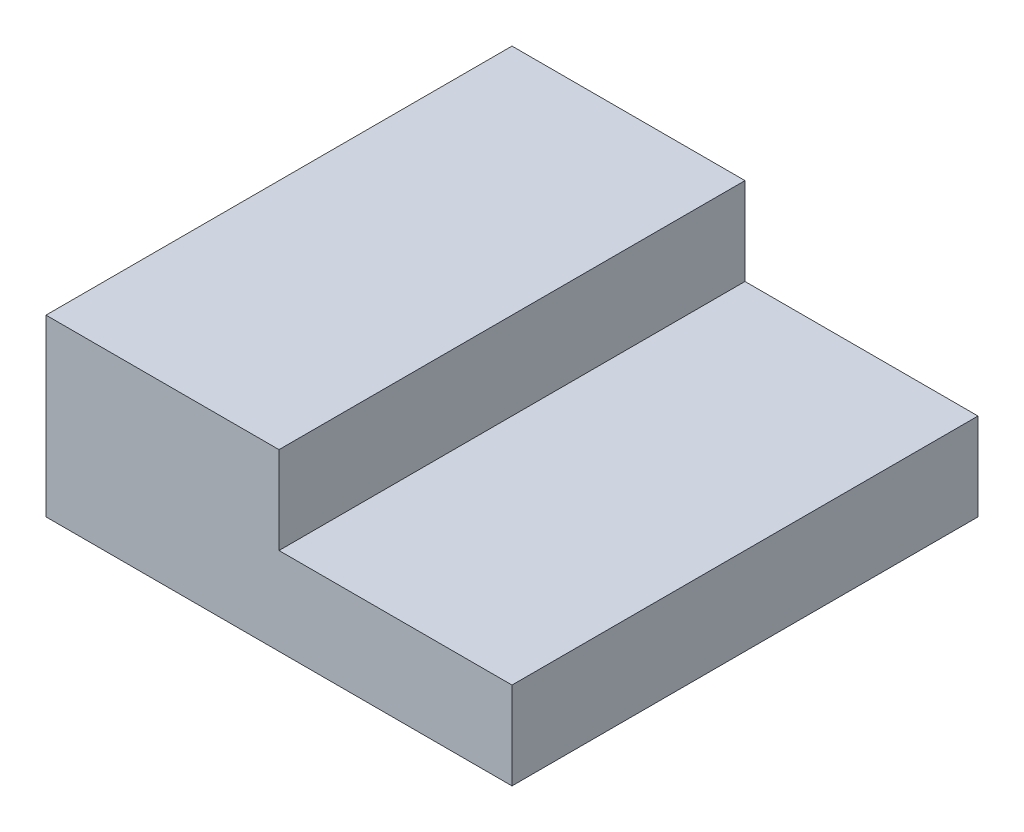
ISO-10303-21;
HEADER;
FILE_DESCRIPTION(('STEP AP214'),'2;1');
FILE_NAME('part.step','',(''),(''),'','','');
FILE_SCHEMA(('AUTOMOTIVE_DESIGN { 1 0 10303 214 1 1 1 1 }'));
ENDSEC;
DATA;
#1=APPLICATION_CONTEXT('core data for automotive mechanical design processes');
#2=APPLICATION_PROTOCOL_DEFINITION('international standard','automotive_design',2000,#1);
#3=PRODUCT_CONTEXT('',#1,'mechanical');
#4=PRODUCT('Part','Part','',(#3));
#5=PRODUCT_RELATED_PRODUCT_CATEGORY('part','',(#4));
#6=PRODUCT_DEFINITION_FORMATION('','',#4);
#7=PRODUCT_DEFINITION_CONTEXT('part definition',#1,'design');
#8=PRODUCT_DEFINITION('design','',#6,#7);
#9=PRODUCT_DEFINITION_SHAPE('','',#8);
#10=(LENGTH_UNIT() NAMED_UNIT(*) SI_UNIT(.MILLI.,.METRE.));
#11=(NAMED_UNIT(*) PLANE_ANGLE_UNIT() SI_UNIT($,.RADIAN.));
#12=(NAMED_UNIT(*) SI_UNIT($,.STERADIAN.) SOLID_ANGLE_UNIT());
#13=UNCERTAINTY_MEASURE_WITH_UNIT(LENGTH_MEASURE(1.E-05),#10,'distance_accuracy_value','');
#14=(GEOMETRIC_REPRESENTATION_CONTEXT(3) GLOBAL_UNCERTAINTY_ASSIGNED_CONTEXT((#13)) GLOBAL_UNIT_ASSIGNED_CONTEXT((#10,
#11,#12)) REPRESENTATION_CONTEXT('',''));
#15=CARTESIAN_POINT('',(0.,0.,0.));
#16=DIRECTION('',(0.,0.,1.));
#17=DIRECTION('',(1.,0.,0.));
#18=AXIS2_PLACEMENT_3D('',#15,#16,#17);
#19=CARTESIAN_POINT('',(0.,228.6,-609.6));
#20=DIRECTION('',(-1.,0.,0.));
#21=DIRECTION('',(0.,-1.,0.));
#22=AXIS2_PLACEMENT_3D('',#19,#20,#21);
#23=PLANE('',#22);
#24=DIRECTION('',(0.,-1.,0.));
#25=VECTOR('',#24,1.);
#26=CARTESIAN_POINT('',(0.,228.6,0.));
#27=LINE('',#26,#25);
#28=CARTESIAN_POINT('',(0.,228.6,0.));
#29=VERTEX_POINT('',#28);
#30=CARTESIAN_POINT('',(0.,0.,0.));
#31=VERTEX_POINT('',#30);
#32=EDGE_CURVE('E120',#29,#31,#27,.T.);
#33=ORIENTED_EDGE('',*,*,#32,.F.);
#34=DIRECTION('',(0.,0.,1.));
#35=VECTOR('',#34,1.);
#36=CARTESIAN_POINT('',(0.,228.6,-609.6));
#37=LINE('',#36,#35);
#38=CARTESIAN_POINT('',(0.,228.6,-609.6));
#39=VERTEX_POINT('',#38);
#40=EDGE_CURVE('E11',#39,#29,#37,.T.);
#41=ORIENTED_EDGE('',*,*,#40,.F.);
#42=DIRECTION('',(0.,-1.,0.));
#43=VECTOR('',#42,1.);
#44=CARTESIAN_POINT('',(0.,228.6,-609.6));
#45=LINE('',#44,#43);
#46=CARTESIAN_POINT('',(0.,0.,-609.6));
#47=VERTEX_POINT('',#46);
#48=EDGE_CURVE('E134',#39,#47,#45,.T.);
#49=ORIENTED_EDGE('',*,*,#48,.T.);
#50=DIRECTION('',(0.,0.,1.));
#51=VECTOR('',#50,1.);
#52=CARTESIAN_POINT('',(0.,0.,-609.6));
#53=LINE('',#52,#51);
#54=EDGE_CURVE('E38',#47,#31,#53,.T.);
#55=ORIENTED_EDGE('',*,*,#54,.T.);
#56=EDGE_LOOP('',(#33,#41,#49,#55));
#57=FACE_BOUND('',#56,.T.);
#58=ADVANCED_FACE('F35',(#57),#23,.T.);
#59=CARTESIAN_POINT('',(304.8,228.6,-609.6));
#60=DIRECTION('',(0.,1.,0.));
#61=DIRECTION('',(-1.,0.,0.));
#62=AXIS2_PLACEMENT_3D('',#59,#60,#61);
#63=PLANE('',#62);
#64=DIRECTION('',(-1.,0.,0.));
#65=VECTOR('',#64,1.);
#66=CARTESIAN_POINT('',(304.8,228.6,0.));
#67=LINE('',#66,#65);
#68=CARTESIAN_POINT('',(304.8,228.6,0.));
#69=VERTEX_POINT('',#68);
#70=EDGE_CURVE('E132',#69,#29,#67,.T.);
#71=ORIENTED_EDGE('',*,*,#70,.F.);
#72=DIRECTION('',(0.,0.,1.));
#73=VECTOR('',#72,1.);
#74=CARTESIAN_POINT('',(304.8,228.6,-609.6));
#75=LINE('',#74,#73);
#76=CARTESIAN_POINT('',(304.8,228.6,-609.6));
#77=VERTEX_POINT('',#76);
#78=EDGE_CURVE('E44',#77,#69,#75,.T.);
#79=ORIENTED_EDGE('',*,*,#78,.F.);
#80=DIRECTION('',(-1.,0.,0.));
#81=VECTOR('',#80,1.);
#82=CARTESIAN_POINT('',(304.8,228.6,-609.6));
#83=LINE('',#82,#81);
#84=EDGE_CURVE('E110',#77,#39,#83,.T.);
#85=ORIENTED_EDGE('',*,*,#84,.T.);
#86=ORIENTED_EDGE('',*,*,#40,.T.);
#87=EDGE_LOOP('',(#71,#79,#85,#86));
#88=FACE_BOUND('',#87,.T.);
#89=ADVANCED_FACE('F142',(#88),#63,.T.);
#90=CARTESIAN_POINT('',(304.8,114.3,-609.6));
#91=DIRECTION('',(1.,0.,0.));
#92=DIRECTION('',(0.,0.,-1.));
#93=AXIS2_PLACEMENT_3D('',#90,#91,#92);
#94=PLANE('',#93);
#95=DIRECTION('',(0.,1.,0.));
#96=VECTOR('',#95,1.);
#97=CARTESIAN_POINT('',(304.8,114.3,0.));
#98=LINE('',#97,#96);
#99=CARTESIAN_POINT('',(304.8,114.3,0.));
#100=VERTEX_POINT('',#99);
#101=EDGE_CURVE('E97',#100,#69,#98,.T.);
#102=ORIENTED_EDGE('',*,*,#101,.F.);
#103=DIRECTION('',(0.,0.,1.));
#104=VECTOR('',#103,1.);
#105=CARTESIAN_POINT('',(304.8,114.3,-609.6));
#106=LINE('',#105,#104);
#107=CARTESIAN_POINT('',(304.8,114.3,-609.6));
#108=VERTEX_POINT('',#107);
#109=EDGE_CURVE('E92',#108,#100,#106,.T.);
#110=ORIENTED_EDGE('',*,*,#109,.F.);
#111=DIRECTION('',(0.,1.,0.));
#112=VECTOR('',#111,1.);
#113=CARTESIAN_POINT('',(304.8,114.3,-609.6));
#114=LINE('',#113,#112);
#115=EDGE_CURVE('E95',#108,#77,#114,.T.);
#116=ORIENTED_EDGE('',*,*,#115,.T.);
#117=ORIENTED_EDGE('',*,*,#78,.T.);
#118=EDGE_LOOP('',(#102,#110,#116,#117));
#119=FACE_BOUND('',#118,.T.);
#120=ADVANCED_FACE('F94',(#119),#94,.T.);
#121=CARTESIAN_POINT('',(609.6,114.3,-609.6));
#122=DIRECTION('',(0.,1.,0.));
#123=DIRECTION('',(-1.,0.,0.));
#124=AXIS2_PLACEMENT_3D('',#121,#122,#123);
#125=PLANE('',#124);
#126=DIRECTION('',(-1.,0.,0.));
#127=VECTOR('',#126,1.);
#128=CARTESIAN_POINT('',(609.6,114.3,0.));
#129=LINE('',#128,#127);
#130=CARTESIAN_POINT('',(609.6,114.3,0.));
#131=VERTEX_POINT('',#130);
#132=EDGE_CURVE('E129',#131,#100,#129,.T.);
#133=ORIENTED_EDGE('',*,*,#132,.F.);
#134=DIRECTION('',(0.,0.,1.));
#135=VECTOR('',#134,1.);
#136=CARTESIAN_POINT('',(609.6,114.3,-609.6));
#137=LINE('',#136,#135);
#138=CARTESIAN_POINT('',(609.6,114.3,-609.6));
#139=VERTEX_POINT('',#138);
#140=EDGE_CURVE('E102',#139,#131,#137,.T.);
#141=ORIENTED_EDGE('',*,*,#140,.F.);
#142=DIRECTION('',(-1.,0.,0.));
#143=VECTOR('',#142,1.);
#144=CARTESIAN_POINT('',(609.6,114.3,-609.6));
#145=LINE('',#144,#143);
#146=EDGE_CURVE('E108',#139,#108,#145,.T.);
#147=ORIENTED_EDGE('',*,*,#146,.T.);
#148=ORIENTED_EDGE('',*,*,#109,.T.);
#149=EDGE_LOOP('',(#133,#141,#147,#148));
#150=FACE_BOUND('',#149,.T.);
#151=ADVANCED_FACE('F112',(#150),#125,.T.);
#152=CARTESIAN_POINT('',(609.6,0.,-609.6));
#153=DIRECTION('',(1.,0.,0.));
#154=DIRECTION('',(0.,0.,-1.));
#155=AXIS2_PLACEMENT_3D('',#152,#153,#154);
#156=PLANE('',#155);
#157=DIRECTION('',(0.,1.,0.));
#158=VECTOR('',#157,1.);
#159=CARTESIAN_POINT('',(609.6,0.,0.));
#160=LINE('',#159,#158);
#161=CARTESIAN_POINT('',(609.6,0.,0.));
#162=VERTEX_POINT('',#161);
#163=EDGE_CURVE('E126',#162,#131,#160,.T.);
#164=ORIENTED_EDGE('',*,*,#163,.F.);
#165=DIRECTION('',(0.,0.,1.));
#166=VECTOR('',#165,1.);
#167=CARTESIAN_POINT('',(609.6,0.,-609.6));
#168=LINE('',#167,#166);
#169=CARTESIAN_POINT('',(609.6,0.,-609.6));
#170=VERTEX_POINT('',#169);
#171=EDGE_CURVE('E137',#170,#162,#168,.T.);
#172=ORIENTED_EDGE('',*,*,#171,.F.);
#173=DIRECTION('',(0.,1.,0.));
#174=VECTOR('',#173,1.);
#175=CARTESIAN_POINT('',(609.6,0.,-609.6));
#176=LINE('',#175,#174);
#177=EDGE_CURVE('E113',#170,#139,#176,.T.);
#178=ORIENTED_EDGE('',*,*,#177,.T.);
#179=ORIENTED_EDGE('',*,*,#140,.T.);
#180=EDGE_LOOP('',(#164,#172,#178,#179));
#181=FACE_BOUND('',#180,.T.);
#182=ADVANCED_FACE('F155',(#181),#156,.T.);
#183=CARTESIAN_POINT('',(0.,0.,-609.6));
#184=DIRECTION('',(0.,-1.,0.));
#185=DIRECTION('',(0.,0.,-1.));
#186=AXIS2_PLACEMENT_3D('',#183,#184,#185);
#187=PLANE('',#186);
#188=DIRECTION('',(1.,0.,0.));
#189=VECTOR('',#188,1.);
#190=CARTESIAN_POINT('',(0.,0.,0.));
#191=LINE('',#190,#189);
#192=EDGE_CURVE('E123',#31,#162,#191,.T.);
#193=ORIENTED_EDGE('',*,*,#192,.F.);
#194=ORIENTED_EDGE('',*,*,#54,.F.);
#195=DIRECTION('',(1.,0.,0.));
#196=VECTOR('',#195,1.);
#197=CARTESIAN_POINT('',(0.,0.,-609.6));
#198=LINE('',#197,#196);
#199=EDGE_CURVE('E115',#47,#170,#198,.T.);
#200=ORIENTED_EDGE('',*,*,#199,.T.);
#201=ORIENTED_EDGE('',*,*,#171,.T.);
#202=EDGE_LOOP('',(#193,#194,#200,#201));
#203=FACE_BOUND('',#202,.T.);
#204=ADVANCED_FACE('F139',(#203),#187,.T.);
#205=CARTESIAN_POINT('',(0.,0.,-609.6));
#206=DIRECTION('',(0.,0.,1.));
#207=DIRECTION('',(1.,0.,0.));
#208=AXIS2_PLACEMENT_3D('',#205,#206,#207);
#209=PLANE('',#208);
#210=ORIENTED_EDGE('',*,*,#48,.F.);
#211=ORIENTED_EDGE('',*,*,#84,.F.);
#212=ORIENTED_EDGE('',*,*,#115,.F.);
#213=ORIENTED_EDGE('',*,*,#146,.F.);
#214=ORIENTED_EDGE('',*,*,#177,.F.);
#215=ORIENTED_EDGE('',*,*,#199,.F.);
#216=EDGE_LOOP('',(#210,#211,#212,#213,#214,#215));
#217=FACE_BOUND('',#216,.T.);
#218=ADVANCED_FACE('F106',(#217),#209,.F.);
#219=CARTESIAN_POINT('',(0.,0.,0.));
#220=DIRECTION('',(0.,0.,1.));
#221=DIRECTION('',(1.,0.,0.));
#222=AXIS2_PLACEMENT_3D('',#219,#220,#221);
#223=PLANE('',#222);
#224=ORIENTED_EDGE('',*,*,#32,.T.);
#225=ORIENTED_EDGE('',*,*,#192,.T.);
#226=ORIENTED_EDGE('',*,*,#163,.T.);
#227=ORIENTED_EDGE('',*,*,#132,.T.);
#228=ORIENTED_EDGE('',*,*,#101,.T.);
#229=ORIENTED_EDGE('',*,*,#70,.T.);
#230=EDGE_LOOP('',(#224,#225,#226,#227,#228,#229));
#231=FACE_BOUND('',#230,.T.);
#232=ADVANCED_FACE('F141',(#231),#223,.T.);
#233=CLOSED_SHELL('',(#58,#89,#120,#151,#182,#204,#218,#232));
#234=MANIFOLD_SOLID_BREP('B2',#233);
#235=ADVANCED_BREP_SHAPE_REPRESENTATION('',(#18,#234),#14);
#236=SHAPE_DEFINITION_REPRESENTATION(#9,#235);
ENDSEC;
END-ISO-10303-21;
